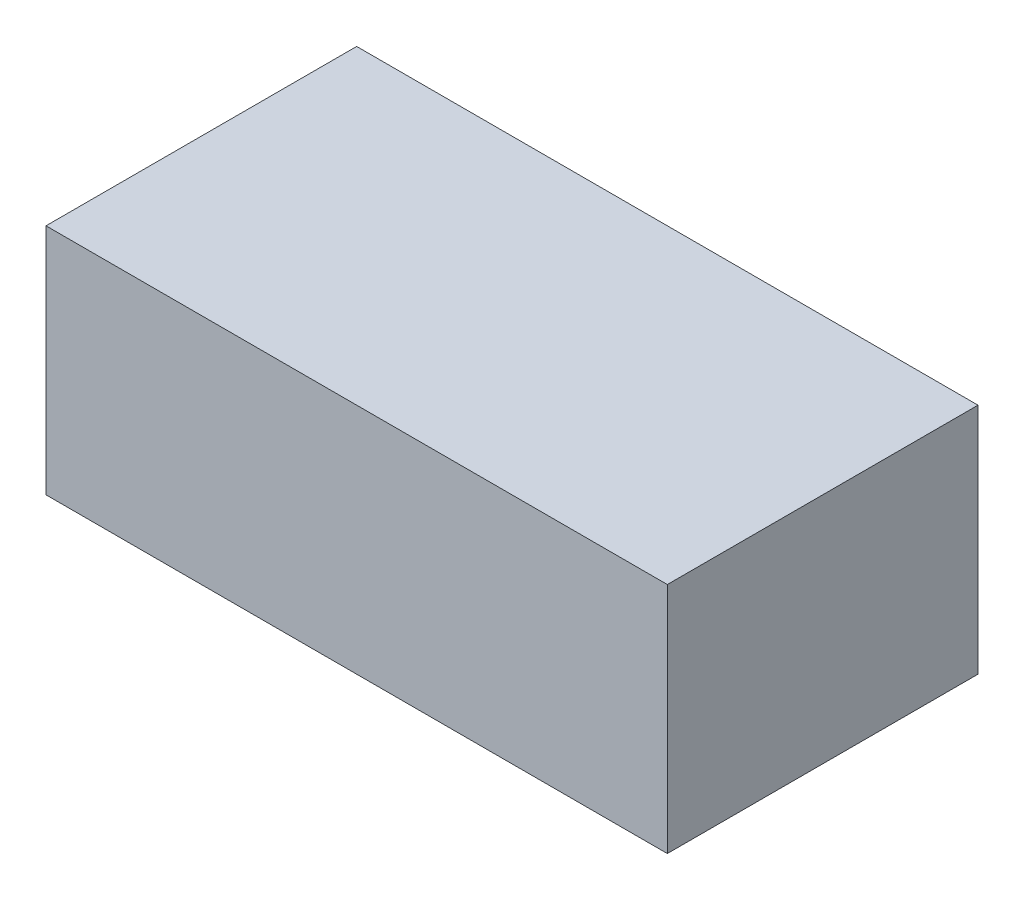
ISO-10303-21;
HEADER;
FILE_DESCRIPTION(('STEP AP214'),'2;1');
FILE_NAME('part.step','',(''),(''),'','','');
FILE_SCHEMA(('AUTOMOTIVE_DESIGN { 1 0 10303 214 1 1 1 1 }'));
ENDSEC;
DATA;
#1=APPLICATION_CONTEXT('core data for automotive mechanical design processes');
#2=APPLICATION_PROTOCOL_DEFINITION('international standard','automotive_design',2000,#1);
#3=PRODUCT_CONTEXT('',#1,'mechanical');
#4=PRODUCT('Part','Part','',(#3));
#5=PRODUCT_RELATED_PRODUCT_CATEGORY('part','',(#4));
#6=PRODUCT_DEFINITION_FORMATION('','',#4);
#7=PRODUCT_DEFINITION_CONTEXT('part definition',#1,'design');
#8=PRODUCT_DEFINITION('design','',#6,#7);
#9=PRODUCT_DEFINITION_SHAPE('','',#8);
#10=(LENGTH_UNIT() NAMED_UNIT(*) SI_UNIT(.MILLI.,.METRE.));
#11=(NAMED_UNIT(*) PLANE_ANGLE_UNIT() SI_UNIT($,.RADIAN.));
#12=(NAMED_UNIT(*) SI_UNIT($,.STERADIAN.) SOLID_ANGLE_UNIT());
#13=UNCERTAINTY_MEASURE_WITH_UNIT(LENGTH_MEASURE(1.E-05),#10,'distance_accuracy_value','');
#14=(GEOMETRIC_REPRESENTATION_CONTEXT(3) GLOBAL_UNCERTAINTY_ASSIGNED_CONTEXT((#13)) GLOBAL_UNIT_ASSIGNED_CONTEXT((#10,
#11,#12)) REPRESENTATION_CONTEXT('',''));
#15=CARTESIAN_POINT('',(0.,0.,0.));
#16=DIRECTION('',(0.,0.,1.));
#17=DIRECTION('',(1.,0.,0.));
#18=AXIS2_PLACEMENT_3D('',#15,#16,#17);
#19=CARTESIAN_POINT('',(0.,0.,20.));
#20=DIRECTION('',(1.,0.,0.));
#21=DIRECTION('',(0.,0.,-1.));
#22=AXIS2_PLACEMENT_3D('',#19,#20,#21);
#23=PLANE('',#22);
#24=DIRECTION('',(0.,-1.,0.));
#25=VECTOR('',#24,1.);
#26=CARTESIAN_POINT('',(0.,0.,0.));
#27=LINE('',#26,#25);
#28=CARTESIAN_POINT('',(0.,15.,0.));
#29=VERTEX_POINT('',#28);
#30=CARTESIAN_POINT('',(0.,0.,0.));
#31=VERTEX_POINT('',#30);
#32=EDGE_CURVE('E96',#29,#31,#27,.T.);
#33=ORIENTED_EDGE('',*,*,#32,.T.);
#34=DIRECTION('',(0.,0.,-1.));
#35=VECTOR('',#34,1.);
#36=CARTESIAN_POINT('',(0.,0.,20.));
#37=LINE('',#36,#35);
#38=CARTESIAN_POINT('',(0.,0.,20.));
#39=VERTEX_POINT('',#38);
#40=EDGE_CURVE('E11',#39,#31,#37,.T.);
#41=ORIENTED_EDGE('',*,*,#40,.F.);
#42=DIRECTION('',(0.,-1.,0.));
#43=VECTOR('',#42,1.);
#44=CARTESIAN_POINT('',(0.,0.,20.));
#45=LINE('',#44,#43);
#46=CARTESIAN_POINT('',(0.,15.,20.));
#47=VERTEX_POINT('',#46);
#48=EDGE_CURVE('E84',#47,#39,#45,.T.);
#49=ORIENTED_EDGE('',*,*,#48,.F.);
#50=DIRECTION('',(0.,0.,-1.));
#51=VECTOR('',#50,1.);
#52=CARTESIAN_POINT('',(0.,15.,20.));
#53=LINE('',#52,#51);
#54=EDGE_CURVE('E92',#47,#29,#53,.T.);
#55=ORIENTED_EDGE('',*,*,#54,.T.);
#56=EDGE_LOOP('',(#33,#41,#49,#55));
#57=FACE_BOUND('',#56,.T.);
#58=ADVANCED_FACE('F33',(#57),#23,.F.);
#59=CARTESIAN_POINT('',(0.,0.,20.));
#60=DIRECTION('',(0.,1.,0.));
#61=DIRECTION('',(0.,0.,1.));
#62=AXIS2_PLACEMENT_3D('',#59,#60,#61);
#63=PLANE('',#62);
#64=DIRECTION('',(1.,0.,0.));
#65=VECTOR('',#64,1.);
#66=CARTESIAN_POINT('',(0.,0.,0.));
#67=LINE('',#66,#65);
#68=CARTESIAN_POINT('',(40.,0.,0.));
#69=VERTEX_POINT('',#68);
#70=EDGE_CURVE('E88',#31,#69,#67,.T.);
#71=ORIENTED_EDGE('',*,*,#70,.T.);
#72=DIRECTION('',(0.,0.,-1.));
#73=VECTOR('',#72,1.);
#74=CARTESIAN_POINT('',(40.,0.,20.));
#75=LINE('',#74,#73);
#76=CARTESIAN_POINT('',(40.,0.,20.));
#77=VERTEX_POINT('',#76);
#78=EDGE_CURVE('E41',#77,#69,#75,.T.);
#79=ORIENTED_EDGE('',*,*,#78,.F.);
#80=DIRECTION('',(1.,0.,0.));
#81=VECTOR('',#80,1.);
#82=CARTESIAN_POINT('',(0.,0.,20.));
#83=LINE('',#82,#81);
#84=EDGE_CURVE('E79',#39,#77,#83,.T.);
#85=ORIENTED_EDGE('',*,*,#84,.F.);
#86=ORIENTED_EDGE('',*,*,#40,.T.);
#87=EDGE_LOOP('',(#71,#79,#85,#86));
#88=FACE_BOUND('',#87,.T.);
#89=ADVANCED_FACE('F87',(#88),#63,.F.);
#90=CARTESIAN_POINT('',(40.,0.,20.));
#91=DIRECTION('',(-1.,0.,0.));
#92=DIRECTION('',(0.,0.,1.));
#93=AXIS2_PLACEMENT_3D('',#90,#91,#92);
#94=PLANE('',#93);
#95=DIRECTION('',(0.,1.,0.));
#96=VECTOR('',#95,1.);
#97=CARTESIAN_POINT('',(40.,0.,0.));
#98=LINE('',#97,#96);
#99=CARTESIAN_POINT('',(40.,15.,0.));
#100=VERTEX_POINT('',#99);
#101=EDGE_CURVE('E66',#69,#100,#98,.T.);
#102=ORIENTED_EDGE('',*,*,#101,.T.);
#103=DIRECTION('',(0.,0.,-1.));
#104=VECTOR('',#103,1.);
#105=CARTESIAN_POINT('',(40.,15.,20.));
#106=LINE('',#105,#104);
#107=CARTESIAN_POINT('',(40.,15.,20.));
#108=VERTEX_POINT('',#107);
#109=EDGE_CURVE('E89',#108,#100,#106,.T.);
#110=ORIENTED_EDGE('',*,*,#109,.F.);
#111=DIRECTION('',(0.,1.,0.));
#112=VECTOR('',#111,1.);
#113=CARTESIAN_POINT('',(40.,0.,20.));
#114=LINE('',#113,#112);
#115=EDGE_CURVE('E82',#77,#108,#114,.T.);
#116=ORIENTED_EDGE('',*,*,#115,.F.);
#117=ORIENTED_EDGE('',*,*,#78,.T.);
#118=EDGE_LOOP('',(#102,#110,#116,#117));
#119=FACE_BOUND('',#118,.T.);
#120=ADVANCED_FACE('F90',(#119),#94,.F.);
#121=CARTESIAN_POINT('',(0.,15.,20.));
#122=DIRECTION('',(0.,-1.,0.));
#123=DIRECTION('',(0.,0.,-1.));
#124=AXIS2_PLACEMENT_3D('',#121,#122,#123);
#125=PLANE('',#124);
#126=DIRECTION('',(-1.,0.,0.));
#127=VECTOR('',#126,1.);
#128=CARTESIAN_POINT('',(0.,15.,0.));
#129=LINE('',#128,#127);
#130=EDGE_CURVE('E72',#100,#29,#129,.T.);
#131=ORIENTED_EDGE('',*,*,#130,.T.);
#132=ORIENTED_EDGE('',*,*,#54,.F.);
#133=DIRECTION('',(-1.,0.,0.));
#134=VECTOR('',#133,1.);
#135=CARTESIAN_POINT('',(0.,15.,20.));
#136=LINE('',#135,#134);
#137=EDGE_CURVE('E49',#108,#47,#136,.T.);
#138=ORIENTED_EDGE('',*,*,#137,.F.);
#139=ORIENTED_EDGE('',*,*,#109,.T.);
#140=EDGE_LOOP('',(#131,#132,#138,#139));
#141=FACE_BOUND('',#140,.T.);
#142=ADVANCED_FACE('F103',(#141),#125,.F.);
#143=CARTESIAN_POINT('',(0.,0.,20.));
#144=DIRECTION('',(0.,0.,-1.));
#145=DIRECTION('',(-1.,0.,0.));
#146=AXIS2_PLACEMENT_3D('',#143,#144,#145);
#147=PLANE('',#146);
#148=ORIENTED_EDGE('',*,*,#48,.T.);
#149=ORIENTED_EDGE('',*,*,#84,.T.);
#150=ORIENTED_EDGE('',*,*,#115,.T.);
#151=ORIENTED_EDGE('',*,*,#137,.T.);
#152=EDGE_LOOP('',(#148,#149,#150,#151));
#153=FACE_BOUND('',#152,.T.);
#154=ADVANCED_FACE('F80',(#153),#147,.F.);
#155=CARTESIAN_POINT('',(0.,0.,0.));
#156=DIRECTION('',(0.,0.,-1.));
#157=DIRECTION('',(-1.,0.,0.));
#158=AXIS2_PLACEMENT_3D('',#155,#156,#157);
#159=PLANE('',#158);
#160=ORIENTED_EDGE('',*,*,#32,.F.);
#161=ORIENTED_EDGE('',*,*,#130,.F.);
#162=ORIENTED_EDGE('',*,*,#101,.F.);
#163=ORIENTED_EDGE('',*,*,#70,.F.);
#164=EDGE_LOOP('',(#160,#161,#162,#163));
#165=FACE_BOUND('',#164,.T.);
#166=ADVANCED_FACE('F106',(#165),#159,.T.);
#167=CLOSED_SHELL('',(#58,#89,#120,#142,#154,#166));
#168=MANIFOLD_SOLID_BREP('B2',#167);
#169=ADVANCED_BREP_SHAPE_REPRESENTATION('',(#18,#168),#14);
#170=SHAPE_DEFINITION_REPRESENTATION(#9,#169);
ENDSEC;
END-ISO-10303-21;
